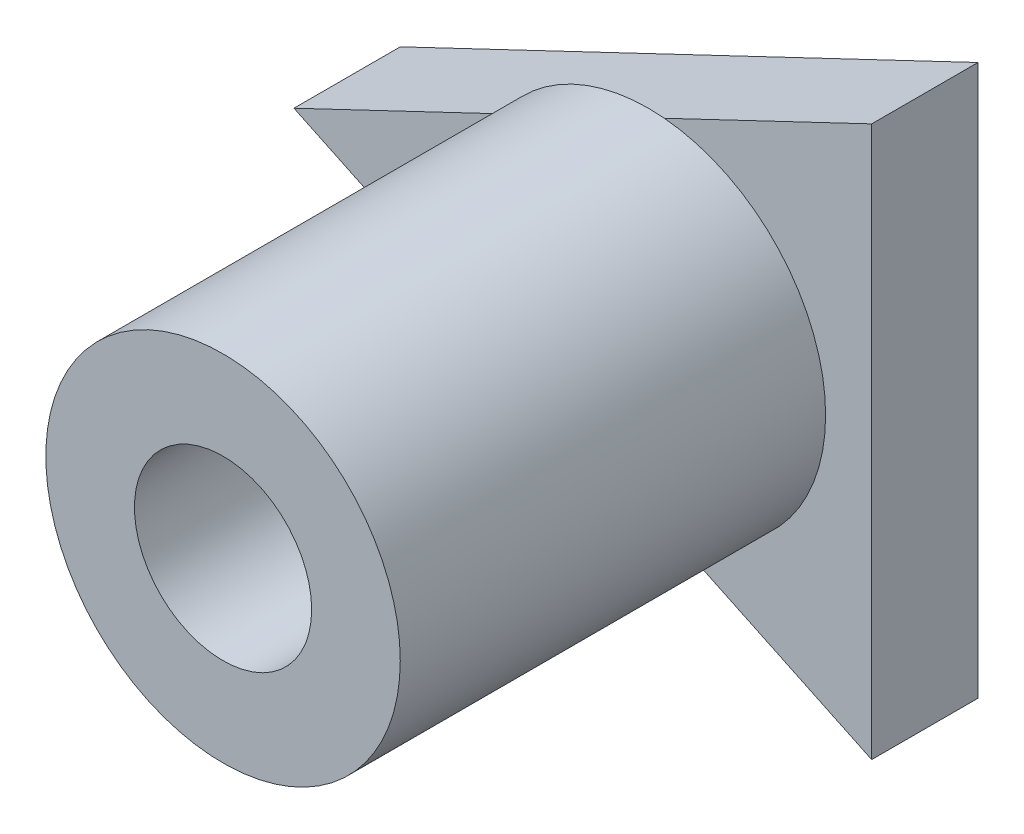
ISO-10303-21;
HEADER;
FILE_DESCRIPTION(('STEP AP214'),'2;1');
FILE_NAME('part.step','',(''),(''),'','','');
FILE_SCHEMA(('AUTOMOTIVE_DESIGN { 1 0 10303 214 1 1 1 1 }'));
ENDSEC;
DATA;
#1=APPLICATION_CONTEXT('core data for automotive mechanical design processes');
#2=APPLICATION_PROTOCOL_DEFINITION('international standard','automotive_design',2000,#1);
#3=PRODUCT_CONTEXT('',#1,'mechanical');
#4=PRODUCT('Part','Part','',(#3));
#5=PRODUCT_RELATED_PRODUCT_CATEGORY('part','',(#4));
#6=PRODUCT_DEFINITION_FORMATION('','',#4);
#7=PRODUCT_DEFINITION_CONTEXT('part definition',#1,'design');
#8=PRODUCT_DEFINITION('design','',#6,#7);
#9=PRODUCT_DEFINITION_SHAPE('','',#8);
#10=(LENGTH_UNIT() NAMED_UNIT(*) SI_UNIT(.MILLI.,.METRE.));
#11=(NAMED_UNIT(*) PLANE_ANGLE_UNIT() SI_UNIT($,.RADIAN.));
#12=(NAMED_UNIT(*) SI_UNIT($,.STERADIAN.) SOLID_ANGLE_UNIT());
#13=UNCERTAINTY_MEASURE_WITH_UNIT(LENGTH_MEASURE(1.E-05),#10,'distance_accuracy_value','');
#14=(GEOMETRIC_REPRESENTATION_CONTEXT(3) GLOBAL_UNCERTAINTY_ASSIGNED_CONTEXT((#13)) GLOBAL_UNIT_ASSIGNED_CONTEXT((#10,
#11,#12)) REPRESENTATION_CONTEXT('',''));
#15=CARTESIAN_POINT('',(0.,0.,0.));
#16=DIRECTION('',(0.,0.,1.));
#17=DIRECTION('',(1.,0.,0.));
#18=AXIS2_PLACEMENT_3D('',#15,#16,#17);
#19=CARTESIAN_POINT('',(0.,0.,3.81));
#20=DIRECTION('',(0.,0.,1.));
#21=DIRECTION('',(1.,0.,0.));
#22=AXIS2_PLACEMENT_3D('',#19,#20,#21);
#23=PLANE('',#22);
#24=CARTESIAN_POINT('',(0.,0.,3.81));
#25=DIRECTION('',(0.,0.,1.));
#26=DIRECTION('',(1.,0.,0.));
#27=AXIS2_PLACEMENT_3D('',#24,#25,#26);
#28=CIRCLE('',#27,6.35);
#29=CARTESIAN_POINT('',(-5.27211396081672,3.53939463526765,3.81));
#30=VERTEX_POINT('',#29);
#31=CARTESIAN_POINT('',(-5.27211396081672,-3.53939463526765,3.81));
#32=VERTEX_POINT('',#31);
#33=EDGE_CURVE('E11',#30,#32,#28,.T.);
#34=ORIENTED_EDGE('',*,*,#33,.F.);
#35=DIRECTION('',(-0.902751698930143,-0.430162027704376,0.));
#36=VECTOR('',#35,1.);
#37=CARTESIAN_POINT('',(8.,9.86356933366416,3.81));
#38=LINE('',#37,#36);
#39=CARTESIAN_POINT('',(-12.7,0.,3.81));
#40=VERTEX_POINT('',#39);
#41=EDGE_CURVE('E98',#30,#40,#38,.T.);
#42=ORIENTED_EDGE('',*,*,#41,.T.);
#43=DIRECTION('',(0.902751698930143,-0.430162027704376,0.));
#44=VECTOR('',#43,1.);
#45=CARTESIAN_POINT('',(-12.7,0.,3.81));
#46=LINE('',#45,#44);
#47=EDGE_CURVE('E118',#40,#32,#46,.T.);
#48=ORIENTED_EDGE('',*,*,#47,.T.);
#49=EDGE_LOOP('',(#34,#42,#48));
#50=FACE_BOUND('',#49,.T.);
#51=ADVANCED_FACE('F41',(#50),#23,.T.);
#52=CARTESIAN_POINT('',(-12.7,0.,3.81));
#53=DIRECTION('',(0.430162027704376,0.902751698930143,0.));
#54=DIRECTION('',(-0.902751698930143,0.430162027704376,0.));
#55=AXIS2_PLACEMENT_3D('',#52,#53,#54);
#56=PLANE('',#55);
#57=DIRECTION('',(0.902751698930143,-0.430162027704376,0.));
#58=VECTOR('',#57,1.);
#59=CARTESIAN_POINT('',(-12.7,0.,0.));
#60=LINE('',#59,#58);
#61=CARTESIAN_POINT('',(-12.7,0.,0.));
#62=VERTEX_POINT('',#61);
#63=CARTESIAN_POINT('',(8.,-9.86356933366416,0.));
#64=VERTEX_POINT('',#63);
#65=EDGE_CURVE('E113',#62,#64,#60,.T.);
#66=ORIENTED_EDGE('',*,*,#65,.T.);
#67=DIRECTION('',(0.,0.,-1.));
#68=VECTOR('',#67,1.);
#69=CARTESIAN_POINT('',(8.,-9.86356933366416,3.81));
#70=LINE('',#69,#68);
#71=CARTESIAN_POINT('',(8.,-9.86356933366416,3.81));
#72=VERTEX_POINT('',#71);
#73=EDGE_CURVE('E45',#72,#64,#70,.T.);
#74=ORIENTED_EDGE('',*,*,#73,.F.);
#75=CARTESIAN_POINT('',(0.572113960816724,-6.32417469839651,3.81));
#76=VERTEX_POINT('',#75);
#77=EDGE_CURVE('E121',#76,#72,#46,.T.);
#78=ORIENTED_EDGE('',*,*,#77,.F.);
#79=EDGE_CURVE('E120',#32,#76,#46,.T.);
#80=ORIENTED_EDGE('',*,*,#79,.F.);
#81=ORIENTED_EDGE('',*,*,#47,.F.);
#82=DIRECTION('',(0.,0.,-1.));
#83=VECTOR('',#82,1.);
#84=CARTESIAN_POINT('',(-12.7,0.,3.81));
#85=LINE('',#84,#83);
#86=EDGE_CURVE('E95',#40,#62,#85,.T.);
#87=ORIENTED_EDGE('',*,*,#86,.T.);
#88=EDGE_LOOP('',(#66,#74,#78,#80,#81,#87));
#89=FACE_BOUND('',#88,.T.);
#90=ADVANCED_FACE('F43',(#89),#56,.F.);
#91=CARTESIAN_POINT('',(8.,-9.86356933366416,3.81));
#92=DIRECTION('',(-1.,0.,0.));
#93=DIRECTION('',(0.,0.,1.));
#94=AXIS2_PLACEMENT_3D('',#91,#92,#93);
#95=PLANE('',#94);
#96=DIRECTION('',(0.,1.,0.));
#97=VECTOR('',#96,1.);
#98=CARTESIAN_POINT('',(8.,-9.86356933366416,0.));
#99=LINE('',#98,#97);
#100=CARTESIAN_POINT('',(8.,9.86356933366416,0.));
#101=VERTEX_POINT('',#100);
#102=EDGE_CURVE('E125',#64,#101,#99,.T.);
#103=ORIENTED_EDGE('',*,*,#102,.T.);
#104=DIRECTION('',(0.,0.,-1.));
#105=VECTOR('',#104,1.);
#106=CARTESIAN_POINT('',(8.,9.86356933366416,3.81));
#107=LINE('',#106,#105);
#108=CARTESIAN_POINT('',(8.,9.86356933366416,3.81));
#109=VERTEX_POINT('',#108);
#110=EDGE_CURVE('E130',#109,#101,#107,.T.);
#111=ORIENTED_EDGE('',*,*,#110,.F.);
#112=DIRECTION('',(0.,1.,0.));
#113=VECTOR('',#112,1.);
#114=CARTESIAN_POINT('',(8.,-9.86356933366416,3.81));
#115=LINE('',#114,#113);
#116=EDGE_CURVE('E91',#72,#109,#115,.T.);
#117=ORIENTED_EDGE('',*,*,#116,.F.);
#118=ORIENTED_EDGE('',*,*,#73,.T.);
#119=EDGE_LOOP('',(#103,#111,#117,#118));
#120=FACE_BOUND('',#119,.T.);
#121=ADVANCED_FACE('F135',(#120),#95,.F.);
#122=CARTESIAN_POINT('',(8.,9.86356933366416,3.81));
#123=DIRECTION('',(0.430162027704376,-0.902751698930143,0.));
#124=DIRECTION('',(0.902751698930143,0.430162027704376,0.));
#125=AXIS2_PLACEMENT_3D('',#122,#123,#124);
#126=PLANE('',#125);
#127=DIRECTION('',(-0.902751698930143,-0.430162027704376,0.));
#128=VECTOR('',#127,1.);
#129=CARTESIAN_POINT('',(8.,9.86356933366416,0.));
#130=LINE('',#129,#128);
#131=EDGE_CURVE('E127',#101,#62,#130,.T.);
#132=ORIENTED_EDGE('',*,*,#131,.T.);
#133=ORIENTED_EDGE('',*,*,#86,.F.);
#134=ORIENTED_EDGE('',*,*,#41,.F.);
#135=CARTESIAN_POINT('',(0.572113960816723,6.32417469839651,3.81));
#136=VERTEX_POINT('',#135);
#137=EDGE_CURVE('E96',#136,#30,#38,.T.);
#138=ORIENTED_EDGE('',*,*,#137,.F.);
#139=EDGE_CURVE('E87',#109,#136,#38,.T.);
#140=ORIENTED_EDGE('',*,*,#139,.F.);
#141=ORIENTED_EDGE('',*,*,#110,.T.);
#142=EDGE_LOOP('',(#132,#133,#134,#138,#140,#141));
#143=FACE_BOUND('',#142,.T.);
#144=ADVANCED_FACE('F100',(#143),#126,.F.);
#145=EDGE_CURVE('E50',#76,#136,#28,.T.);
#146=ORIENTED_EDGE('',*,*,#145,.F.);
#147=ORIENTED_EDGE('',*,*,#77,.T.);
#148=ORIENTED_EDGE('',*,*,#116,.T.);
#149=ORIENTED_EDGE('',*,*,#139,.T.);
#150=EDGE_LOOP('',(#146,#147,#148,#149));
#151=FACE_BOUND('',#150,.T.);
#152=ADVANCED_FACE('F89',(#151),#23,.T.);
#153=CARTESIAN_POINT('',(0.,0.,0.));
#154=DIRECTION('',(0.,0.,1.));
#155=DIRECTION('',(1.,0.,0.));
#156=AXIS2_PLACEMENT_3D('',#153,#154,#155);
#157=PLANE('',#156);
#158=CARTESIAN_POINT('',(0.,0.,0.));
#159=DIRECTION('',(0.,0.,1.));
#160=DIRECTION('',(1.,0.,0.));
#161=AXIS2_PLACEMENT_3D('',#158,#159,#160);
#162=CIRCLE('',#161,3.17499999999999);
#163=CARTESIAN_POINT('',(3.17499999999999,0.,0.));
#164=VERTEX_POINT('',#163);
#165=EDGE_CURVE('E115',#164,#164,#162,.T.);
#166=ORIENTED_EDGE('',*,*,#165,.T.);
#167=EDGE_LOOP('',(#166));
#168=FACE_BOUND('',#167,.T.);
#169=ORIENTED_EDGE('',*,*,#65,.F.);
#170=ORIENTED_EDGE('',*,*,#131,.F.);
#171=ORIENTED_EDGE('',*,*,#102,.F.);
#172=EDGE_LOOP('',(#169,#170,#171));
#173=FACE_BOUND('',#172,.T.);
#174=ADVANCED_FACE('F140',(#168,#173),#157,.F.);
#175=CARTESIAN_POINT('',(0.,0.,3.81));
#176=DIRECTION('',(0.,0.,1.));
#177=DIRECTION('',(1.,0.,0.));
#178=AXIS2_PLACEMENT_3D('',#175,#176,#177);
#179=PLANE('',#178);
#180=EDGE_CURVE('E52',#32,#76,#28,.T.);
#181=ORIENTED_EDGE('',*,*,#180,.F.);
#182=ORIENTED_EDGE('',*,*,#79,.T.);
#183=EDGE_LOOP('',(#181,#182));
#184=FACE_BOUND('',#183,.T.);
#185=ADVANCED_FACE('F143',(#184),#179,.F.);
#186=EDGE_CURVE('E108',#136,#30,#28,.T.);
#187=ORIENTED_EDGE('',*,*,#186,.F.);
#188=ORIENTED_EDGE('',*,*,#137,.T.);
#189=EDGE_LOOP('',(#187,#188));
#190=FACE_BOUND('',#189,.T.);
#191=ADVANCED_FACE('F110',(#190),#179,.F.);
#192=CARTESIAN_POINT('',(0.,0.,19.05));
#193=DIRECTION('',(0.,0.,-1.));
#194=DIRECTION('',(-1.,0.,0.));
#195=AXIS2_PLACEMENT_3D('',#192,#193,#194);
#196=CYLINDRICAL_SURFACE('',#195,6.35);
#197=CARTESIAN_POINT('',(0.,0.,19.05));
#198=DIRECTION('',(0.,0.,1.));
#199=DIRECTION('',(1.,0.,0.));
#200=AXIS2_PLACEMENT_3D('',#197,#198,#199);
#201=CIRCLE('',#200,6.35);
#202=CARTESIAN_POINT('',(6.35,0.,19.05));
#203=VERTEX_POINT('',#202);
#204=EDGE_CURVE('E111',#203,#203,#201,.T.);
#205=ORIENTED_EDGE('',*,*,#204,.F.);
#206=EDGE_LOOP('',(#205));
#207=FACE_BOUND('',#206,.T.);
#208=ORIENTED_EDGE('',*,*,#186,.T.);
#209=ORIENTED_EDGE('',*,*,#33,.T.);
#210=ORIENTED_EDGE('',*,*,#180,.T.);
#211=ORIENTED_EDGE('',*,*,#145,.T.);
#212=EDGE_LOOP('',(#208,#209,#210,#211));
#213=FACE_BOUND('',#212,.T.);
#214=ADVANCED_FACE('F107',(#207,#213),#196,.T.);
#215=CARTESIAN_POINT('',(0.,0.,19.05));
#216=DIRECTION('',(0.,0.,1.));
#217=DIRECTION('',(1.,0.,0.));
#218=AXIS2_PLACEMENT_3D('',#215,#216,#217);
#219=PLANE('',#218);
#220=CARTESIAN_POINT('',(0.,0.,19.05));
#221=DIRECTION('',(0.,0.,1.));
#222=DIRECTION('',(1.,0.,0.));
#223=AXIS2_PLACEMENT_3D('',#220,#221,#222);
#224=CIRCLE('',#223,3.17499999999999);
#225=CARTESIAN_POINT('',(3.17499999999999,0.,19.05));
#226=VERTEX_POINT('',#225);
#227=EDGE_CURVE('E237',#226,#226,#224,.T.);
#228=ORIENTED_EDGE('',*,*,#227,.F.);
#229=EDGE_LOOP('',(#228));
#230=FACE_BOUND('',#229,.T.);
#231=ORIENTED_EDGE('',*,*,#204,.T.);
#232=EDGE_LOOP('',(#231));
#233=FACE_BOUND('',#232,.T.);
#234=ADVANCED_FACE('F212',(#230,#233),#219,.T.);
#235=CARTESIAN_POINT('',(0.,0.,19.05));
#236=DIRECTION('',(0.,0.,1.));
#237=DIRECTION('',(1.,0.,0.));
#238=AXIS2_PLACEMENT_3D('',#235,#236,#237);
#239=CYLINDRICAL_SURFACE('',#238,3.17499999999999);
#240=ORIENTED_EDGE('',*,*,#165,.F.);
#241=EDGE_LOOP('',(#240));
#242=FACE_BOUND('',#241,.T.);
#243=ORIENTED_EDGE('',*,*,#227,.T.);
#244=EDGE_LOOP('',(#243));
#245=FACE_BOUND('',#244,.T.);
#246=ADVANCED_FACE('F220',(#242,#245),#239,.F.);
#247=CLOSED_SHELL('',(#51,#90,#121,#144,#152,#174,#185,#191,#214,#234,#246));
#248=MANIFOLD_SOLID_BREP('B2',#247);
#249=ADVANCED_BREP_SHAPE_REPRESENTATION('',(#18,#248),#14);
#250=SHAPE_DEFINITION_REPRESENTATION(#9,#249);
ENDSEC;
END-ISO-10303-21;
